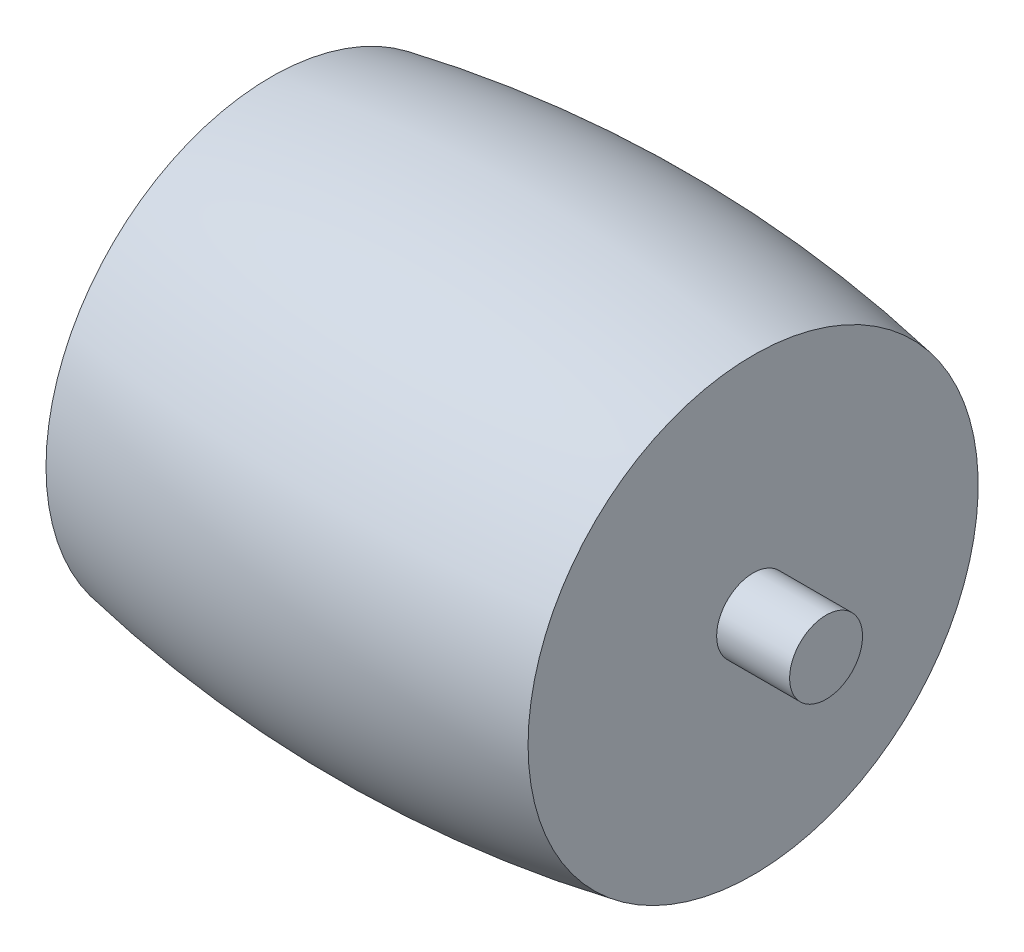
ISO-10303-21;
HEADER;
FILE_DESCRIPTION(('STEP AP214'),'2;1');
FILE_NAME('part.step','',(''),(''),'','','');
FILE_SCHEMA(('AUTOMOTIVE_DESIGN { 1 0 10303 214 1 1 1 1 }'));
ENDSEC;
DATA;
#1=APPLICATION_CONTEXT('core data for automotive mechanical design processes');
#2=APPLICATION_PROTOCOL_DEFINITION('international standard','automotive_design',2000,#1);
#3=PRODUCT_CONTEXT('',#1,'mechanical');
#4=PRODUCT('Part','Part','',(#3));
#5=PRODUCT_RELATED_PRODUCT_CATEGORY('part','',(#4));
#6=PRODUCT_DEFINITION_FORMATION('','',#4);
#7=PRODUCT_DEFINITION_CONTEXT('part definition',#1,'design');
#8=PRODUCT_DEFINITION('design','',#6,#7);
#9=PRODUCT_DEFINITION_SHAPE('','',#8);
#10=(LENGTH_UNIT() NAMED_UNIT(*) SI_UNIT(.MILLI.,.METRE.));
#11=(NAMED_UNIT(*) PLANE_ANGLE_UNIT() SI_UNIT($,.RADIAN.));
#12=(NAMED_UNIT(*) SI_UNIT($,.STERADIAN.) SOLID_ANGLE_UNIT());
#13=UNCERTAINTY_MEASURE_WITH_UNIT(LENGTH_MEASURE(1.E-05),#10,'distance_accuracy_value','');
#14=(GEOMETRIC_REPRESENTATION_CONTEXT(3) GLOBAL_UNCERTAINTY_ASSIGNED_CONTEXT((#13)) GLOBAL_UNIT_ASSIGNED_CONTEXT((#10,
#11,#12)) REPRESENTATION_CONTEXT('',''));
#15=CARTESIAN_POINT('',(0.,0.,0.));
#16=DIRECTION('',(0.,0.,1.));
#17=DIRECTION('',(1.,0.,0.));
#18=AXIS2_PLACEMENT_3D('',#15,#16,#17);
#19=CARTESIAN_POINT('',(-2.22000000000026,40.5,0.));
#20=DIRECTION('',(-1.,0.,0.));
#21=DIRECTION('',(0.,0.,1.));
#22=AXIS2_PLACEMENT_3D('',#19,#20,#21);
#23=CYLINDRICAL_SURFACE('',#22,0.335999999999995);
#24=CARTESIAN_POINT('',(2.21999999999973,40.5,0.));
#25=DIRECTION('',(-1.,0.,0.));
#26=DIRECTION('',(0.,0.,1.));
#27=AXIS2_PLACEMENT_3D('',#24,#25,#26);
#28=CIRCLE('',#27,0.335999999999995);
#29=CARTESIAN_POINT('',(2.21999999999973,40.5,0.335999999999995));
#30=VERTEX_POINT('',#29);
#31=EDGE_CURVE('E10',#30,#30,#28,.T.);
#32=ORIENTED_EDGE('',*,*,#31,.F.);
#33=EDGE_LOOP('',(#32));
#34=FACE_BOUND('',#33,.T.);
#35=CARTESIAN_POINT('',(2.89199999999974,40.5,0.));
#36=DIRECTION('',(-1.,0.,0.));
#37=DIRECTION('',(0.,0.,1.));
#38=AXIS2_PLACEMENT_3D('',#35,#36,#37);
#39=CIRCLE('',#38,0.335999999999995);
#40=CARTESIAN_POINT('',(2.89199999999974,40.5,0.335999999999995));
#41=VERTEX_POINT('',#40);
#42=EDGE_CURVE('E57',#41,#41,#39,.T.);
#43=ORIENTED_EDGE('',*,*,#42,.T.);
#44=EDGE_LOOP('',(#43));
#45=FACE_BOUND('',#44,.T.);
#46=ADVANCED_FACE('F35',(#34,#45),#23,.T.);
#47=CARTESIAN_POINT('',(2.21999999999974,42.5728622479871,0.));
#48=DIRECTION('',(-1.,0.,0.));
#49=DIRECTION('',(0.,0.,1.));
#50=AXIS2_PLACEMENT_3D('',#47,#48,#49);
#51=PLANE('',#50);
#52=CARTESIAN_POINT('',(2.21999999999974,40.5,0.));
#53=DIRECTION('',(-1.,0.,0.));
#54=DIRECTION('',(0.,0.,1.));
#55=AXIS2_PLACEMENT_3D('',#52,#53,#54);
#56=CIRCLE('',#55,2.07286224798712);
#57=CARTESIAN_POINT('',(2.21999999999974,40.5,2.07286224798712));
#58=VERTEX_POINT('',#57);
#59=EDGE_CURVE('E41',#58,#58,#56,.T.);
#60=ORIENTED_EDGE('',*,*,#59,.F.);
#61=EDGE_LOOP('',(#60));
#62=FACE_BOUND('',#61,.T.);
#63=ORIENTED_EDGE('',*,*,#31,.T.);
#64=EDGE_LOOP('',(#63));
#65=FACE_BOUND('',#64,.T.);
#66=ADVANCED_FACE('F73',(#62,#65),#51,.F.);
#67=CARTESIAN_POINT('',(-2.63637924240319E-13,40.5,0.));
#68=DIRECTION('',(-1.,0.,0.));
#69=DIRECTION('',(0.,0.,1.));
#70=AXIS2_PLACEMENT_3D('',#67,#68,#69);
#71=DEGENERATE_TOROIDAL_SURFACE('',#70,9.72,12.,.F.);
#72=CARTESIAN_POINT('',(-2.22000000000027,40.5,0.));
#73=DIRECTION('',(-1.,0.,0.));
#74=DIRECTION('',(0.,0.,1.));
#75=AXIS2_PLACEMENT_3D('',#72,#73,#74);
#76=CIRCLE('',#75,2.07286224798713);
#77=CARTESIAN_POINT('',(-2.22000000000027,40.5,2.07286224798713));
#78=VERTEX_POINT('',#77);
#79=EDGE_CURVE('E45',#78,#78,#76,.T.);
#80=ORIENTED_EDGE('',*,*,#79,.F.);
#81=EDGE_LOOP('',(#80));
#82=FACE_BOUND('',#81,.T.);
#83=ORIENTED_EDGE('',*,*,#59,.T.);
#84=EDGE_LOOP('',(#83));
#85=FACE_BOUND('',#84,.T.);
#86=ADVANCED_FACE('F78',(#82,#85),#71,.F.);
#87=CARTESIAN_POINT('',(-2.22000000000026,42.5728622479871,0.));
#88=DIRECTION('',(1.,0.,0.));
#89=DIRECTION('',(0.,0.,-1.));
#90=AXIS2_PLACEMENT_3D('',#87,#88,#89);
#91=PLANE('',#90);
#92=CARTESIAN_POINT('',(-2.22000000000026,40.5,0.));
#93=DIRECTION('',(-1.,0.,0.));
#94=DIRECTION('',(0.,0.,1.));
#95=AXIS2_PLACEMENT_3D('',#92,#93,#94);
#96=CIRCLE('',#95,0.335999999999995);
#97=CARTESIAN_POINT('',(-2.22000000000026,40.5,0.335999999999995));
#98=VERTEX_POINT('',#97);
#99=EDGE_CURVE('E49',#98,#98,#96,.T.);
#100=ORIENTED_EDGE('',*,*,#99,.F.);
#101=EDGE_LOOP('',(#100));
#102=FACE_BOUND('',#101,.T.);
#103=ORIENTED_EDGE('',*,*,#79,.T.);
#104=EDGE_LOOP('',(#103));
#105=FACE_BOUND('',#104,.T.);
#106=ADVANCED_FACE('F83',(#102,#105),#91,.F.);
#107=CARTESIAN_POINT('',(-2.22000000000026,40.5,0.));
#108=DIRECTION('',(-1.,0.,0.));
#109=DIRECTION('',(0.,0.,1.));
#110=AXIS2_PLACEMENT_3D('',#107,#108,#109);
#111=CYLINDRICAL_SURFACE('',#110,0.335999999999995);
#112=CARTESIAN_POINT('',(-2.89200000000026,40.5,0.));
#113=DIRECTION('',(-1.,0.,0.));
#114=DIRECTION('',(0.,0.,1.));
#115=AXIS2_PLACEMENT_3D('',#112,#113,#114);
#116=CIRCLE('',#115,0.335999999999995);
#117=CARTESIAN_POINT('',(-2.89200000000026,40.5,0.335999999999995));
#118=VERTEX_POINT('',#117);
#119=EDGE_CURVE('E54',#118,#118,#116,.T.);
#120=ORIENTED_EDGE('',*,*,#119,.F.);
#121=EDGE_LOOP('',(#120));
#122=FACE_BOUND('',#121,.T.);
#123=ORIENTED_EDGE('',*,*,#99,.T.);
#124=EDGE_LOOP('',(#123));
#125=FACE_BOUND('',#124,.T.);
#126=ADVANCED_FACE('F69',(#122,#125),#111,.T.);
#127=CARTESIAN_POINT('',(-2.89200000000026,40.836,0.));
#128=DIRECTION('',(1.,0.,0.));
#129=DIRECTION('',(0.,0.,-1.));
#130=AXIS2_PLACEMENT_3D('',#127,#128,#129);
#131=PLANE('',#130);
#132=ORIENTED_EDGE('',*,*,#119,.T.);
#133=EDGE_LOOP('',(#132));
#134=FACE_BOUND('',#133,.T.);
#135=ADVANCED_FACE('F64',(#134),#131,.F.);
#136=CARTESIAN_POINT('',(2.89199999999974,40.836,0.));
#137=DIRECTION('',(-1.,0.,0.));
#138=DIRECTION('',(0.,0.,1.));
#139=AXIS2_PLACEMENT_3D('',#136,#137,#138);
#140=PLANE('',#139);
#141=ORIENTED_EDGE('',*,*,#42,.F.);
#142=EDGE_LOOP('',(#141));
#143=FACE_BOUND('',#142,.T.);
#144=ADVANCED_FACE('F62',(#143),#140,.F.);
#145=CLOSED_SHELL('',(#46,#66,#86,#106,#126,#135,#144));
#146=MANIFOLD_SOLID_BREP('B2',#145);
#147=ADVANCED_BREP_SHAPE_REPRESENTATION('',(#18,#146),#14);
#148=SHAPE_DEFINITION_REPRESENTATION(#9,#147);
ENDSEC;
END-ISO-10303-21;
